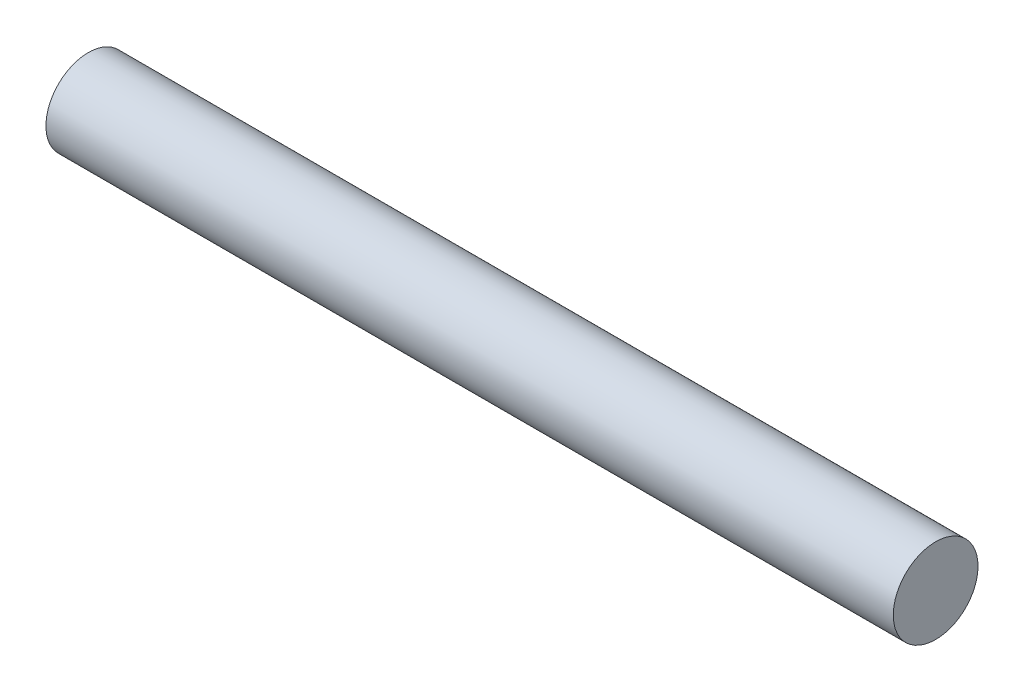
ISO-10303-21;
HEADER;
FILE_DESCRIPTION(('STEP AP214'),'2;1');
FILE_NAME('part.step','',(''),(''),'','','');
FILE_SCHEMA(('AUTOMOTIVE_DESIGN { 1 0 10303 214 1 1 1 1 }'));
ENDSEC;
DATA;
#1=APPLICATION_CONTEXT('core data for automotive mechanical design processes');
#2=APPLICATION_PROTOCOL_DEFINITION('international standard','automotive_design',2000,#1);
#3=PRODUCT_CONTEXT('',#1,'mechanical');
#4=PRODUCT('Part','Part','',(#3));
#5=PRODUCT_RELATED_PRODUCT_CATEGORY('part','',(#4));
#6=PRODUCT_DEFINITION_FORMATION('','',#4);
#7=PRODUCT_DEFINITION_CONTEXT('part definition',#1,'design');
#8=PRODUCT_DEFINITION('design','',#6,#7);
#9=PRODUCT_DEFINITION_SHAPE('','',#8);
#10=(LENGTH_UNIT() NAMED_UNIT(*) SI_UNIT(.MILLI.,.METRE.));
#11=(NAMED_UNIT(*) PLANE_ANGLE_UNIT() SI_UNIT($,.RADIAN.));
#12=(NAMED_UNIT(*) SI_UNIT($,.STERADIAN.) SOLID_ANGLE_UNIT());
#13=UNCERTAINTY_MEASURE_WITH_UNIT(LENGTH_MEASURE(1.E-05),#10,'distance_accuracy_value','');
#14=(GEOMETRIC_REPRESENTATION_CONTEXT(3) GLOBAL_UNCERTAINTY_ASSIGNED_CONTEXT((#13)) GLOBAL_UNIT_ASSIGNED_CONTEXT((#10,
#11,#12)) REPRESENTATION_CONTEXT('',''));
#15=CARTESIAN_POINT('',(0.,0.,0.));
#16=DIRECTION('',(0.,0.,1.));
#17=DIRECTION('',(1.,0.,0.));
#18=AXIS2_PLACEMENT_3D('',#15,#16,#17);
#19=CARTESIAN_POINT('',(200.,0.,0.));
#20=DIRECTION('',(-1.,0.,0.));
#21=DIRECTION('',(0.,0.,1.));
#22=AXIS2_PLACEMENT_3D('',#19,#20,#21);
#23=CYLINDRICAL_SURFACE('',#22,10.);
#24=CARTESIAN_POINT('',(200.,0.,0.));
#25=DIRECTION('',(1.,0.,0.));
#26=DIRECTION('',(0.,0.,-1.));
#27=AXIS2_PLACEMENT_3D('',#24,#25,#26);
#28=CIRCLE('',#27,10.);
#29=CARTESIAN_POINT('',(200.,0.,-10.));
#30=VERTEX_POINT('',#29);
#31=EDGE_CURVE('E10',#30,#30,#28,.T.);
#32=ORIENTED_EDGE('',*,*,#31,.F.);
#33=EDGE_LOOP('',(#32));
#34=FACE_BOUND('',#33,.T.);
#35=CARTESIAN_POINT('',(0.,0.,0.));
#36=DIRECTION('',(1.,0.,0.));
#37=DIRECTION('',(0.,0.,-1.));
#38=AXIS2_PLACEMENT_3D('',#35,#36,#37);
#39=CIRCLE('',#38,10.);
#40=CARTESIAN_POINT('',(0.,0.,-10.));
#41=VERTEX_POINT('',#40);
#42=EDGE_CURVE('E34',#41,#41,#39,.T.);
#43=ORIENTED_EDGE('',*,*,#42,.T.);
#44=EDGE_LOOP('',(#43));
#45=FACE_BOUND('',#44,.T.);
#46=ADVANCED_FACE('F31',(#34,#45),#23,.T.);
#47=CARTESIAN_POINT('',(200.,0.,0.));
#48=DIRECTION('',(1.,0.,0.));
#49=DIRECTION('',(0.,0.,-1.));
#50=AXIS2_PLACEMENT_3D('',#47,#48,#49);
#51=PLANE('',#50);
#52=ORIENTED_EDGE('',*,*,#31,.T.);
#53=EDGE_LOOP('',(#52));
#54=FACE_BOUND('',#53,.T.);
#55=ADVANCED_FACE('F46',(#54),#51,.T.);
#56=CARTESIAN_POINT('',(0.,0.,0.));
#57=DIRECTION('',(1.,0.,0.));
#58=DIRECTION('',(0.,0.,-1.));
#59=AXIS2_PLACEMENT_3D('',#56,#57,#58);
#60=PLANE('',#59);
#61=ORIENTED_EDGE('',*,*,#42,.F.);
#62=EDGE_LOOP('',(#61));
#63=FACE_BOUND('',#62,.T.);
#64=ADVANCED_FACE('F44',(#63),#60,.F.);
#65=CLOSED_SHELL('',(#46,#55,#64));
#66=MANIFOLD_SOLID_BREP('B2',#65);
#67=ADVANCED_BREP_SHAPE_REPRESENTATION('',(#18,#66),#14);
#68=SHAPE_DEFINITION_REPRESENTATION(#9,#67);
ENDSEC;
END-ISO-10303-21;
